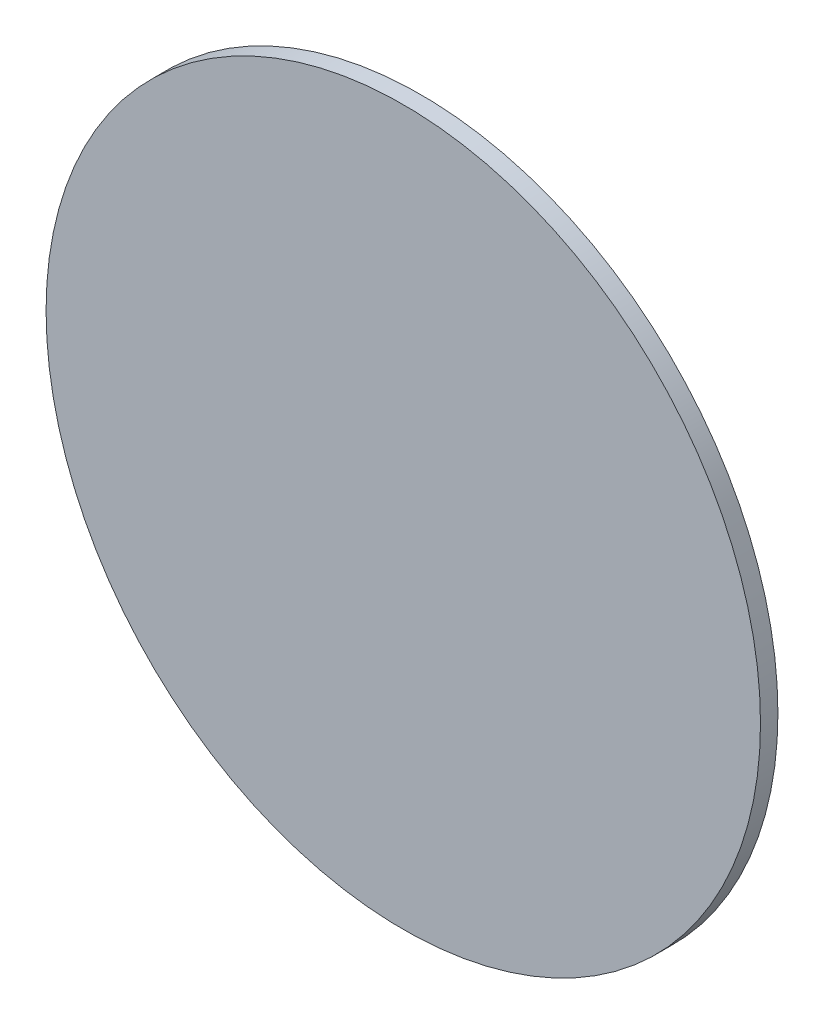
ISO-10303-21;
HEADER;
FILE_DESCRIPTION(('STEP AP214'),'2;1');
FILE_NAME('part.step','',(''),(''),'','','');
FILE_SCHEMA(('AUTOMOTIVE_DESIGN { 1 0 10303 214 1 1 1 1 }'));
ENDSEC;
DATA;
#1=APPLICATION_CONTEXT('core data for automotive mechanical design processes');
#2=APPLICATION_PROTOCOL_DEFINITION('international standard','automotive_design',2000,#1);
#3=PRODUCT_CONTEXT('',#1,'mechanical');
#4=PRODUCT('Part','Part','',(#3));
#5=PRODUCT_RELATED_PRODUCT_CATEGORY('part','',(#4));
#6=PRODUCT_DEFINITION_FORMATION('','',#4);
#7=PRODUCT_DEFINITION_CONTEXT('part definition',#1,'design');
#8=PRODUCT_DEFINITION('design','',#6,#7);
#9=PRODUCT_DEFINITION_SHAPE('','',#8);
#10=(LENGTH_UNIT() NAMED_UNIT(*) SI_UNIT(.MILLI.,.METRE.));
#11=(NAMED_UNIT(*) PLANE_ANGLE_UNIT() SI_UNIT($,.RADIAN.));
#12=(NAMED_UNIT(*) SI_UNIT($,.STERADIAN.) SOLID_ANGLE_UNIT());
#13=UNCERTAINTY_MEASURE_WITH_UNIT(LENGTH_MEASURE(1.E-05),#10,'distance_accuracy_value','');
#14=(GEOMETRIC_REPRESENTATION_CONTEXT(3) GLOBAL_UNCERTAINTY_ASSIGNED_CONTEXT((#13)) GLOBAL_UNIT_ASSIGNED_CONTEXT((#10,
#11,#12)) REPRESENTATION_CONTEXT('',''));
#15=CARTESIAN_POINT('',(0.,0.,0.));
#16=DIRECTION('',(0.,0.,1.));
#17=DIRECTION('',(1.,0.,0.));
#18=AXIS2_PLACEMENT_3D('',#15,#16,#17);
#19=CARTESIAN_POINT('',(0.,0.,0.2));
#20=DIRECTION('',(0.,0.,-1.));
#21=DIRECTION('',(-1.,0.,0.));
#22=AXIS2_PLACEMENT_3D('',#19,#20,#21);
#23=CYLINDRICAL_SURFACE('',#22,4.1);
#24=CARTESIAN_POINT('',(0.,0.,0.2));
#25=DIRECTION('',(0.,0.,1.));
#26=DIRECTION('',(1.,0.,0.));
#27=AXIS2_PLACEMENT_3D('',#24,#25,#26);
#28=CIRCLE('',#27,4.1);
#29=CARTESIAN_POINT('',(4.1,0.,0.2));
#30=VERTEX_POINT('',#29);
#31=EDGE_CURVE('E10',#30,#30,#28,.T.);
#32=ORIENTED_EDGE('',*,*,#31,.F.);
#33=EDGE_LOOP('',(#32));
#34=FACE_BOUND('',#33,.T.);
#35=CARTESIAN_POINT('',(0.,0.,0.));
#36=DIRECTION('',(0.,0.,1.));
#37=DIRECTION('',(1.,0.,0.));
#38=AXIS2_PLACEMENT_3D('',#35,#36,#37);
#39=CIRCLE('',#38,4.1);
#40=CARTESIAN_POINT('',(4.1,0.,0.));
#41=VERTEX_POINT('',#40);
#42=EDGE_CURVE('E35',#41,#41,#39,.T.);
#43=ORIENTED_EDGE('',*,*,#42,.T.);
#44=EDGE_LOOP('',(#43));
#45=FACE_BOUND('',#44,.T.);
#46=ADVANCED_FACE('F32',(#34,#45),#23,.T.);
#47=CARTESIAN_POINT('',(0.,0.,0.2));
#48=DIRECTION('',(0.,0.,1.));
#49=DIRECTION('',(1.,0.,0.));
#50=AXIS2_PLACEMENT_3D('',#47,#48,#49);
#51=PLANE('',#50);
#52=ORIENTED_EDGE('',*,*,#31,.T.);
#53=EDGE_LOOP('',(#52));
#54=FACE_BOUND('',#53,.T.);
#55=ADVANCED_FACE('F47',(#54),#51,.T.);
#56=CARTESIAN_POINT('',(0.,0.,0.));
#57=DIRECTION('',(0.,0.,1.));
#58=DIRECTION('',(1.,0.,0.));
#59=AXIS2_PLACEMENT_3D('',#56,#57,#58);
#60=PLANE('',#59);
#61=ORIENTED_EDGE('',*,*,#42,.F.);
#62=EDGE_LOOP('',(#61));
#63=FACE_BOUND('',#62,.T.);
#64=ADVANCED_FACE('F45',(#63),#60,.F.);
#65=CLOSED_SHELL('',(#46,#55,#64));
#66=MANIFOLD_SOLID_BREP('B2',#65);
#67=ADVANCED_BREP_SHAPE_REPRESENTATION('',(#18,#66),#14);
#68=SHAPE_DEFINITION_REPRESENTATION(#9,#67);
ENDSEC;
END-ISO-10303-21;
